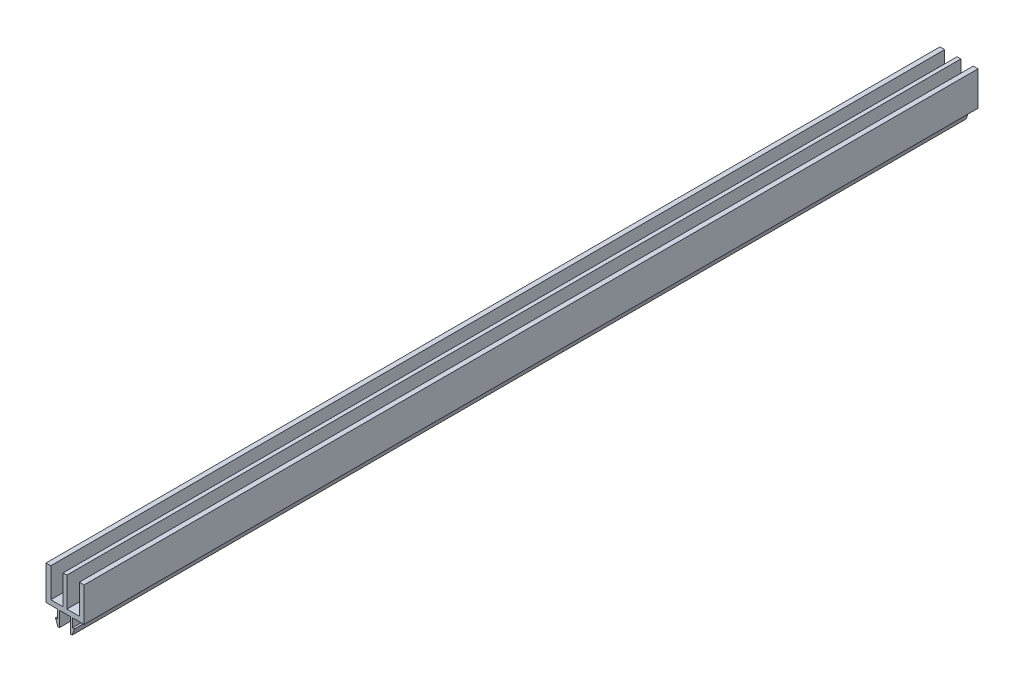
ISO-10303-21;
HEADER;
FILE_DESCRIPTION(('STEP AP214'),'2;1');
FILE_NAME('part.step','',(''),(''),'','','');
FILE_SCHEMA(('AUTOMOTIVE_DESIGN { 1 0 10303 214 1 1 1 1 }'));
ENDSEC;
DATA;
#1=APPLICATION_CONTEXT('core data for automotive mechanical design processes');
#2=APPLICATION_PROTOCOL_DEFINITION('international standard','automotive_design',2000,#1);
#3=PRODUCT_CONTEXT('',#1,'mechanical');
#4=PRODUCT('Part','Part','',(#3));
#5=PRODUCT_RELATED_PRODUCT_CATEGORY('part','',(#4));
#6=PRODUCT_DEFINITION_FORMATION('','',#4);
#7=PRODUCT_DEFINITION_CONTEXT('part definition',#1,'design');
#8=PRODUCT_DEFINITION('design','',#6,#7);
#9=PRODUCT_DEFINITION_SHAPE('','',#8);
#10=(LENGTH_UNIT() NAMED_UNIT(*) SI_UNIT(.MILLI.,.METRE.));
#11=(NAMED_UNIT(*) PLANE_ANGLE_UNIT() SI_UNIT($,.RADIAN.));
#12=(NAMED_UNIT(*) SI_UNIT($,.STERADIAN.) SOLID_ANGLE_UNIT());
#13=UNCERTAINTY_MEASURE_WITH_UNIT(LENGTH_MEASURE(1.E-05),#10,'distance_accuracy_value','');
#14=(GEOMETRIC_REPRESENTATION_CONTEXT(3) GLOBAL_UNCERTAINTY_ASSIGNED_CONTEXT((#13)) GLOBAL_UNIT_ASSIGNED_CONTEXT((#10,
#11,#12)) REPRESENTATION_CONTEXT('',''));
#15=CARTESIAN_POINT('',(0.,0.,0.));
#16=DIRECTION('',(0.,0.,1.));
#17=DIRECTION('',(1.,0.,0.));
#18=AXIS2_PLACEMENT_3D('',#15,#16,#17);
#19=CARTESIAN_POINT('',(-1.,17.9999999975,-420.));
#20=DIRECTION('',(-1.,0.,0.));
#21=DIRECTION('',(0.,-1.,0.));
#22=AXIS2_PLACEMENT_3D('',#19,#20,#21);
#23=PLANE('',#22);
#24=DIRECTION('',(0.,-1.,0.));
#25=VECTOR('',#24,1.);
#26=CARTESIAN_POINT('',(-1.,17.9999999975,50.));
#27=LINE('',#26,#25);
#28=CARTESIAN_POINT('',(-1.,17.9999999975,50.));
#29=VERTEX_POINT('',#28);
#30=CARTESIAN_POINT('',(-1.,2.4999999995,50.));
#31=VERTEX_POINT('',#30);
#32=EDGE_CURVE('E226',#29,#31,#27,.T.);
#33=ORIENTED_EDGE('',*,*,#32,.F.);
#34=DIRECTION('',(0.,0.,1.));
#35=VECTOR('',#34,1.);
#36=CARTESIAN_POINT('',(-1.,17.9999999975,-420.));
#37=LINE('',#36,#35);
#38=CARTESIAN_POINT('',(-1.,17.9999999975,-420.));
#39=VERTEX_POINT('',#38);
#40=EDGE_CURVE('E11',#39,#29,#37,.T.);
#41=ORIENTED_EDGE('',*,*,#40,.F.);
#42=DIRECTION('',(0.,-1.,0.));
#43=VECTOR('',#42,1.);
#44=CARTESIAN_POINT('',(-1.,17.9999999975,-420.));
#45=LINE('',#44,#43);
#46=CARTESIAN_POINT('',(-1.,2.4999999995,-420.));
#47=VERTEX_POINT('',#46);
#48=EDGE_CURVE('E294',#39,#47,#45,.T.);
#49=ORIENTED_EDGE('',*,*,#48,.T.);
#50=DIRECTION('',(0.,0.,1.));
#51=VECTOR('',#50,1.);
#52=CARTESIAN_POINT('',(-1.,2.4999999995,-420.));
#53=LINE('',#52,#51);
#54=EDGE_CURVE('E36',#47,#31,#53,.T.);
#55=ORIENTED_EDGE('',*,*,#54,.T.);
#56=EDGE_LOOP('',(#33,#41,#49,#55));
#57=FACE_BOUND('',#56,.T.);
#58=ADVANCED_FACE('F33',(#57),#23,.T.);
#59=CARTESIAN_POINT('',(0.999999999999998,17.9999999975,-420.));
#60=DIRECTION('',(0.,1.,0.));
#61=DIRECTION('',(0.,0.,1.));
#62=AXIS2_PLACEMENT_3D('',#59,#60,#61);
#63=PLANE('',#62);
#64=DIRECTION('',(-1.,0.,0.));
#65=VECTOR('',#64,1.);
#66=CARTESIAN_POINT('',(0.999999999999998,17.9999999975,50.));
#67=LINE('',#66,#65);
#68=CARTESIAN_POINT('',(0.999999999999998,17.9999999975,50.));
#69=VERTEX_POINT('',#68);
#70=EDGE_CURVE('E292',#69,#29,#67,.T.);
#71=ORIENTED_EDGE('',*,*,#70,.F.);
#72=DIRECTION('',(0.,0.,1.));
#73=VECTOR('',#72,1.);
#74=CARTESIAN_POINT('',(0.999999999999998,17.9999999975,-420.));
#75=LINE('',#74,#73);
#76=CARTESIAN_POINT('',(0.999999999999998,17.9999999975,-420.));
#77=VERTEX_POINT('',#76);
#78=EDGE_CURVE('E42',#77,#69,#75,.T.);
#79=ORIENTED_EDGE('',*,*,#78,.F.);
#80=DIRECTION('',(-1.,0.,0.));
#81=VECTOR('',#80,1.);
#82=CARTESIAN_POINT('',(0.999999999999998,17.9999999975,-420.));
#83=LINE('',#82,#81);
#84=EDGE_CURVE('E216',#77,#39,#83,.T.);
#85=ORIENTED_EDGE('',*,*,#84,.T.);
#86=ORIENTED_EDGE('',*,*,#40,.T.);
#87=EDGE_LOOP('',(#71,#79,#85,#86));
#88=FACE_BOUND('',#87,.T.);
#89=ADVANCED_FACE('F338',(#88),#63,.T.);
#90=CARTESIAN_POINT('',(0.999999999999998,2.4999999995,-420.));
#91=DIRECTION('',(1.,0.,0.));
#92=DIRECTION('',(0.,0.,-1.));
#93=AXIS2_PLACEMENT_3D('',#90,#91,#92);
#94=PLANE('',#93);
#95=DIRECTION('',(0.,1.,0.));
#96=VECTOR('',#95,1.);
#97=CARTESIAN_POINT('',(0.999999999999998,2.4999999995,50.));
#98=LINE('',#97,#96);
#99=CARTESIAN_POINT('',(0.999999999999998,2.4999999995,50.));
#100=VERTEX_POINT('',#99);
#101=EDGE_CURVE('E203',#100,#69,#98,.T.);
#102=ORIENTED_EDGE('',*,*,#101,.F.);
#103=DIRECTION('',(0.,0.,1.));
#104=VECTOR('',#103,1.);
#105=CARTESIAN_POINT('',(0.999999999999998,2.4999999995,-420.));
#106=LINE('',#105,#104);
#107=CARTESIAN_POINT('',(0.999999999999998,2.4999999995,-420.));
#108=VERTEX_POINT('',#107);
#109=EDGE_CURVE('E198',#108,#100,#106,.T.);
#110=ORIENTED_EDGE('',*,*,#109,.F.);
#111=DIRECTION('',(0.,1.,0.));
#112=VECTOR('',#111,1.);
#113=CARTESIAN_POINT('',(0.999999999999998,2.4999999995,-420.));
#114=LINE('',#113,#112);
#115=EDGE_CURVE('E201',#108,#77,#114,.T.);
#116=ORIENTED_EDGE('',*,*,#115,.T.);
#117=ORIENTED_EDGE('',*,*,#78,.T.);
#118=EDGE_LOOP('',(#102,#110,#116,#117));
#119=FACE_BOUND('',#118,.T.);
#120=ADVANCED_FACE('F200',(#119),#94,.T.);
#121=CARTESIAN_POINT('',(7.5,2.4999999995,-420.));
#122=DIRECTION('',(0.,1.,0.));
#123=DIRECTION('',(-1.,0.,0.));
#124=AXIS2_PLACEMENT_3D('',#121,#122,#123);
#125=PLANE('',#124);
#126=DIRECTION('',(-1.,0.,0.));
#127=VECTOR('',#126,1.);
#128=CARTESIAN_POINT('',(7.5,2.4999999995,50.));
#129=LINE('',#128,#127);
#130=CARTESIAN_POINT('',(7.5,2.4999999995,50.));
#131=VERTEX_POINT('',#130);
#132=EDGE_CURVE('E289',#131,#100,#129,.T.);
#133=ORIENTED_EDGE('',*,*,#132,.F.);
#134=DIRECTION('',(0.,0.,1.));
#135=VECTOR('',#134,1.);
#136=CARTESIAN_POINT('',(7.5,2.4999999995,-420.));
#137=LINE('',#136,#135);
#138=CARTESIAN_POINT('',(7.5,2.4999999995,-420.));
#139=VERTEX_POINT('',#138);
#140=EDGE_CURVE('E208',#139,#131,#137,.T.);
#141=ORIENTED_EDGE('',*,*,#140,.F.);
#142=DIRECTION('',(-1.,0.,0.));
#143=VECTOR('',#142,1.);
#144=CARTESIAN_POINT('',(7.5,2.4999999995,-420.));
#145=LINE('',#144,#143);
#146=EDGE_CURVE('E214',#139,#108,#145,.T.);
#147=ORIENTED_EDGE('',*,*,#146,.T.);
#148=ORIENTED_EDGE('',*,*,#109,.T.);
#149=EDGE_LOOP('',(#133,#141,#147,#148));
#150=FACE_BOUND('',#149,.T.);
#151=ADVANCED_FACE('F218',(#150),#125,.T.);
#152=CARTESIAN_POINT('',(7.5,17.9999999975,-420.));
#153=DIRECTION('',(-1.,0.,0.));
#154=DIRECTION('',(0.,-1.,0.));
#155=AXIS2_PLACEMENT_3D('',#152,#153,#154);
#156=PLANE('',#155);
#157=DIRECTION('',(0.,-1.,0.));
#158=VECTOR('',#157,1.);
#159=CARTESIAN_POINT('',(7.5,17.9999999975,50.));
#160=LINE('',#159,#158);
#161=CARTESIAN_POINT('',(7.5,17.9999999975,50.));
#162=VERTEX_POINT('',#161);
#163=EDGE_CURVE('E286',#162,#131,#160,.T.);
#164=ORIENTED_EDGE('',*,*,#163,.F.);
#165=DIRECTION('',(0.,0.,1.));
#166=VECTOR('',#165,1.);
#167=CARTESIAN_POINT('',(7.5,17.9999999975,-420.));
#168=LINE('',#167,#166);
#169=CARTESIAN_POINT('',(7.5,17.9999999975,-420.));
#170=VERTEX_POINT('',#169);
#171=EDGE_CURVE('E298',#170,#162,#168,.T.);
#172=ORIENTED_EDGE('',*,*,#171,.F.);
#173=DIRECTION('',(0.,-1.,0.));
#174=VECTOR('',#173,1.);
#175=CARTESIAN_POINT('',(7.5,17.9999999975,-420.));
#176=LINE('',#175,#174);
#177=EDGE_CURVE('E219',#170,#139,#176,.T.);
#178=ORIENTED_EDGE('',*,*,#177,.T.);
#179=ORIENTED_EDGE('',*,*,#140,.T.);
#180=EDGE_LOOP('',(#164,#172,#178,#179));
#181=FACE_BOUND('',#180,.T.);
#182=ADVANCED_FACE('F351',(#181),#156,.T.);
#183=CARTESIAN_POINT('',(10.,17.9999999975,-420.));
#184=DIRECTION('',(0.,1.,0.));
#185=DIRECTION('',(0.,0.,1.));
#186=AXIS2_PLACEMENT_3D('',#183,#184,#185);
#187=PLANE('',#186);
#188=DIRECTION('',(-1.,0.,0.));
#189=VECTOR('',#188,1.);
#190=CARTESIAN_POINT('',(10.,17.9999999975,50.));
#191=LINE('',#190,#189);
#192=CARTESIAN_POINT('',(10.,17.9999999975,50.));
#193=VERTEX_POINT('',#192);
#194=EDGE_CURVE('E283',#193,#162,#191,.T.);
#195=ORIENTED_EDGE('',*,*,#194,.F.);
#196=DIRECTION('',(0.,0.,1.));
#197=VECTOR('',#196,1.);
#198=CARTESIAN_POINT('',(10.,17.9999999975,-420.));
#199=LINE('',#198,#197);
#200=CARTESIAN_POINT('',(10.,17.9999999975,-420.));
#201=VERTEX_POINT('',#200);
#202=EDGE_CURVE('E300',#201,#193,#199,.T.);
#203=ORIENTED_EDGE('',*,*,#202,.F.);
#204=DIRECTION('',(-1.,0.,0.));
#205=VECTOR('',#204,1.);
#206=CARTESIAN_POINT('',(10.,17.9999999975,-420.));
#207=LINE('',#206,#205);
#208=EDGE_CURVE('E221',#201,#170,#207,.T.);
#209=ORIENTED_EDGE('',*,*,#208,.T.);
#210=ORIENTED_EDGE('',*,*,#171,.T.);
#211=EDGE_LOOP('',(#195,#203,#209,#210));
#212=FACE_BOUND('',#211,.T.);
#213=ADVANCED_FACE('F354',(#212),#187,.T.);
#214=CARTESIAN_POINT('',(10.,-4.99999828349541E-10,-420.));
#215=DIRECTION('',(1.,0.,0.));
#216=DIRECTION('',(0.,0.,-1.));
#217=AXIS2_PLACEMENT_3D('',#214,#215,#216);
#218=PLANE('',#217);
#219=DIRECTION('',(0.,1.,0.));
#220=VECTOR('',#219,1.);
#221=CARTESIAN_POINT('',(10.,-4.99999828349541E-10,50.));
#222=LINE('',#221,#220);
#223=CARTESIAN_POINT('',(10.,-4.99999828349541E-10,50.));
#224=VERTEX_POINT('',#223);
#225=EDGE_CURVE('E280',#224,#193,#222,.T.);
#226=ORIENTED_EDGE('',*,*,#225,.F.);
#227=DIRECTION('',(0.,0.,1.));
#228=VECTOR('',#227,1.);
#229=CARTESIAN_POINT('',(10.,-4.99999828349541E-10,-420.));
#230=LINE('',#229,#228);
#231=CARTESIAN_POINT('',(10.,-4.99999828349541E-10,-420.));
#232=VERTEX_POINT('',#231);
#233=EDGE_CURVE('E302',#232,#224,#230,.T.);
#234=ORIENTED_EDGE('',*,*,#233,.F.);
#235=DIRECTION('',(0.,1.,0.));
#236=VECTOR('',#235,1.);
#237=CARTESIAN_POINT('',(10.,-4.99999828349541E-10,-420.));
#238=LINE('',#237,#236);
#239=EDGE_CURVE('E644',#232,#201,#238,.T.);
#240=ORIENTED_EDGE('',*,*,#239,.T.);
#241=ORIENTED_EDGE('',*,*,#202,.T.);
#242=EDGE_LOOP('',(#226,#234,#240,#241));
#243=FACE_BOUND('',#242,.T.);
#244=ADVANCED_FACE('F358',(#243),#218,.T.);
#245=CARTESIAN_POINT('',(4.,-4.99999998002099E-10,-420.));
#246=DIRECTION('',(0.,-1.,0.));
#247=DIRECTION('',(1.,0.,0.));
#248=AXIS2_PLACEMENT_3D('',#245,#246,#247);
#249=PLANE('',#248);
#250=DIRECTION('',(1.,0.,0.));
#251=VECTOR('',#250,1.);
#252=CARTESIAN_POINT('',(4.,-4.99999998002099E-10,50.));
#253=LINE('',#252,#251);
#254=CARTESIAN_POINT('',(4.,-4.99999998002099E-10,50.));
#255=VERTEX_POINT('',#254);
#256=EDGE_CURVE('E277',#255,#224,#253,.T.);
#257=ORIENTED_EDGE('',*,*,#256,.F.);
#258=DIRECTION('',(0.,0.,1.));
#259=VECTOR('',#258,1.);
#260=CARTESIAN_POINT('',(4.,-4.99999998002099E-10,-420.));
#261=LINE('',#260,#259);
#262=CARTESIAN_POINT('',(4.,-4.99999998002099E-10,-420.));
#263=VERTEX_POINT('',#262);
#264=EDGE_CURVE('E304',#263,#255,#261,.T.);
#265=ORIENTED_EDGE('',*,*,#264,.F.);
#266=DIRECTION('',(1.,0.,0.));
#267=VECTOR('',#266,1.);
#268=CARTESIAN_POINT('',(4.,-4.99999998002099E-10,-420.));
#269=LINE('',#268,#267);
#270=EDGE_CURVE('E648',#263,#232,#269,.T.);
#271=ORIENTED_EDGE('',*,*,#270,.T.);
#272=ORIENTED_EDGE('',*,*,#233,.T.);
#273=EDGE_LOOP('',(#257,#265,#271,#272));
#274=FACE_BOUND('',#273,.T.);
#275=ADVANCED_FACE('F362',(#274),#249,.T.);
#276=CARTESIAN_POINT('',(4.,-4.5,-420.));
#277=DIRECTION('',(1.,0.,0.));
#278=DIRECTION('',(0.,0.,-1.));
#279=AXIS2_PLACEMENT_3D('',#276,#277,#278);
#280=PLANE('',#279);
#281=DIRECTION('',(0.,1.,0.));
#282=VECTOR('',#281,1.);
#283=CARTESIAN_POINT('',(4.,-4.5,50.));
#284=LINE('',#283,#282);
#285=CARTESIAN_POINT('',(4.,-4.5,50.));
#286=VERTEX_POINT('',#285);
#287=EDGE_CURVE('E274',#286,#255,#284,.T.);
#288=ORIENTED_EDGE('',*,*,#287,.F.);
#289=DIRECTION('',(0.,0.,1.));
#290=VECTOR('',#289,1.);
#291=CARTESIAN_POINT('',(4.,-4.5,-420.));
#292=LINE('',#291,#290);
#293=CARTESIAN_POINT('',(4.,-4.5,-420.));
#294=VERTEX_POINT('',#293);
#295=EDGE_CURVE('E306',#294,#286,#292,.T.);
#296=ORIENTED_EDGE('',*,*,#295,.F.);
#297=DIRECTION('',(0.,1.,0.));
#298=VECTOR('',#297,1.);
#299=CARTESIAN_POINT('',(4.,-4.5,-420.));
#300=LINE('',#299,#298);
#301=EDGE_CURVE('E637',#294,#263,#300,.T.);
#302=ORIENTED_EDGE('',*,*,#301,.T.);
#303=ORIENTED_EDGE('',*,*,#264,.T.);
#304=EDGE_LOOP('',(#288,#296,#302,#303));
#305=FACE_BOUND('',#304,.T.);
#306=ADVANCED_FACE('F366',(#305),#280,.T.);
#307=CARTESIAN_POINT('',(5.,-4.5,-420.));
#308=DIRECTION('',(0.,1.,0.));
#309=DIRECTION('',(0.,0.,1.));
#310=AXIS2_PLACEMENT_3D('',#307,#308,#309);
#311=PLANE('',#310);
#312=DIRECTION('',(-1.,0.,0.));
#313=VECTOR('',#312,1.);
#314=CARTESIAN_POINT('',(5.,-4.5,50.));
#315=LINE('',#314,#313);
#316=CARTESIAN_POINT('',(5.,-4.5,50.));
#317=VERTEX_POINT('',#316);
#318=EDGE_CURVE('E271',#317,#286,#315,.T.);
#319=ORIENTED_EDGE('',*,*,#318,.F.);
#320=DIRECTION('',(0.,0.,1.));
#321=VECTOR('',#320,1.);
#322=CARTESIAN_POINT('',(5.,-4.5,-420.));
#323=LINE('',#322,#321);
#324=CARTESIAN_POINT('',(5.,-4.5,-420.));
#325=VERTEX_POINT('',#324);
#326=EDGE_CURVE('E308',#325,#317,#323,.T.);
#327=ORIENTED_EDGE('',*,*,#326,.F.);
#328=DIRECTION('',(-1.,0.,0.));
#329=VECTOR('',#328,1.);
#330=CARTESIAN_POINT('',(5.,-4.5,-420.));
#331=LINE('',#330,#329);
#332=EDGE_CURVE('E633',#325,#294,#331,.T.);
#333=ORIENTED_EDGE('',*,*,#332,.T.);
#334=ORIENTED_EDGE('',*,*,#295,.T.);
#335=EDGE_LOOP('',(#319,#327,#333,#334));
#336=FACE_BOUND('',#335,.T.);
#337=ADVANCED_FACE('F370',(#336),#311,.T.);
#338=CARTESIAN_POINT('',(3.75,-8.,-420.));
#339=DIRECTION('',(0.941741911594837,-0.336336396998157,0.));
#340=DIRECTION('',(0.336336396998157,0.941741911594837,0.));
#341=AXIS2_PLACEMENT_3D('',#338,#339,#340);
#342=PLANE('',#341);
#343=DIRECTION('',(0.336336396998157,0.941741911594837,0.));
#344=VECTOR('',#343,1.);
#345=CARTESIAN_POINT('',(3.75,-8.,50.));
#346=LINE('',#345,#344);
#347=CARTESIAN_POINT('',(3.75,-8.,50.));
#348=VERTEX_POINT('',#347);
#349=EDGE_CURVE('E268',#348,#317,#346,.T.);
#350=ORIENTED_EDGE('',*,*,#349,.F.);
#351=DIRECTION('',(0.,0.,1.));
#352=VECTOR('',#351,1.);
#353=CARTESIAN_POINT('',(3.75,-8.,-420.));
#354=LINE('',#353,#352);
#355=CARTESIAN_POINT('',(3.75,-8.,-420.));
#356=VERTEX_POINT('',#355);
#357=EDGE_CURVE('E310',#356,#348,#354,.T.);
#358=ORIENTED_EDGE('',*,*,#357,.F.);
#359=DIRECTION('',(0.336336396998157,0.941741911594837,0.));
#360=VECTOR('',#359,1.);
#361=CARTESIAN_POINT('',(3.75,-8.,-420.));
#362=LINE('',#361,#360);
#363=EDGE_CURVE('E654',#356,#325,#362,.T.);
#364=ORIENTED_EDGE('',*,*,#363,.T.);
#365=ORIENTED_EDGE('',*,*,#326,.T.);
#366=EDGE_LOOP('',(#350,#358,#364,#365));
#367=FACE_BOUND('',#366,.T.);
#368=ADVANCED_FACE('F374',(#367),#342,.T.);
#369=CARTESIAN_POINT('',(3.,-8.,-420.));
#370=DIRECTION('',(0.,-1.,0.));
#371=DIRECTION('',(0.,0.,-1.));
#372=AXIS2_PLACEMENT_3D('',#369,#370,#371);
#373=PLANE('',#372);
#374=DIRECTION('',(1.,0.,0.));
#375=VECTOR('',#374,1.);
#376=CARTESIAN_POINT('',(3.,-8.,50.));
#377=LINE('',#376,#375);
#378=CARTESIAN_POINT('',(3.,-8.,50.));
#379=VERTEX_POINT('',#378);
#380=EDGE_CURVE('E265',#379,#348,#377,.T.);
#381=ORIENTED_EDGE('',*,*,#380,.F.);
#382=DIRECTION('',(0.,0.,1.));
#383=VECTOR('',#382,1.);
#384=CARTESIAN_POINT('',(3.,-8.,-420.));
#385=LINE('',#384,#383);
#386=CARTESIAN_POINT('',(3.,-8.,-420.));
#387=VERTEX_POINT('',#386);
#388=EDGE_CURVE('E312',#387,#379,#385,.T.);
#389=ORIENTED_EDGE('',*,*,#388,.F.);
#390=DIRECTION('',(1.,0.,0.));
#391=VECTOR('',#390,1.);
#392=CARTESIAN_POINT('',(3.,-8.,-420.));
#393=LINE('',#392,#391);
#394=EDGE_CURVE('E626',#387,#356,#393,.T.);
#395=ORIENTED_EDGE('',*,*,#394,.T.);
#396=ORIENTED_EDGE('',*,*,#357,.T.);
#397=EDGE_LOOP('',(#381,#389,#395,#396));
#398=FACE_BOUND('',#397,.T.);
#399=ADVANCED_FACE('F378',(#398),#373,.T.);
#400=CARTESIAN_POINT('',(3.,-4.9999985194348E-10,-420.));
#401=DIRECTION('',(-1.,0.,0.));
#402=DIRECTION('',(0.,0.,1.));
#403=AXIS2_PLACEMENT_3D('',#400,#401,#402);
#404=PLANE('',#403);
#405=DIRECTION('',(0.,-1.,0.));
#406=VECTOR('',#405,1.);
#407=CARTESIAN_POINT('',(3.,-4.9999985194348E-10,50.));
#408=LINE('',#407,#406);
#409=CARTESIAN_POINT('',(3.,-4.9999985194348E-10,50.));
#410=VERTEX_POINT('',#409);
#411=EDGE_CURVE('E262',#410,#379,#408,.T.);
#412=ORIENTED_EDGE('',*,*,#411,.F.);
#413=DIRECTION('',(0.,0.,1.));
#414=VECTOR('',#413,1.);
#415=CARTESIAN_POINT('',(3.,-4.9999985194348E-10,-420.));
#416=LINE('',#415,#414);
#417=CARTESIAN_POINT('',(3.,-4.9999985194348E-10,-420.));
#418=VERTEX_POINT('',#417);
#419=EDGE_CURVE('E314',#418,#410,#416,.T.);
#420=ORIENTED_EDGE('',*,*,#419,.F.);
#421=DIRECTION('',(0.,-1.,0.));
#422=VECTOR('',#421,1.);
#423=CARTESIAN_POINT('',(3.,-4.9999985194348E-10,-420.));
#424=LINE('',#423,#422);
#425=EDGE_CURVE('E622',#418,#387,#424,.T.);
#426=ORIENTED_EDGE('',*,*,#425,.T.);
#427=ORIENTED_EDGE('',*,*,#388,.T.);
#428=EDGE_LOOP('',(#412,#420,#426,#427));
#429=FACE_BOUND('',#428,.T.);
#430=ADVANCED_FACE('F382',(#429),#404,.T.);
#431=CARTESIAN_POINT('',(-3.,-4.99999455901012E-10,-420.));
#432=DIRECTION('',(0.,-1.,0.));
#433=DIRECTION('',(1.,0.,0.));
#434=AXIS2_PLACEMENT_3D('',#431,#432,#433);
#435=PLANE('',#434);
#436=DIRECTION('',(1.,0.,0.));
#437=VECTOR('',#436,1.);
#438=CARTESIAN_POINT('',(-3.,-4.99999455901012E-10,50.));
#439=LINE('',#438,#437);
#440=CARTESIAN_POINT('',(-3.,-4.99999455901012E-10,50.));
#441=VERTEX_POINT('',#440);
#442=EDGE_CURVE('E259',#441,#410,#439,.T.);
#443=ORIENTED_EDGE('',*,*,#442,.F.);
#444=DIRECTION('',(0.,0.,1.));
#445=VECTOR('',#444,1.);
#446=CARTESIAN_POINT('',(-3.,-4.99999455901012E-10,-420.));
#447=LINE('',#446,#445);
#448=CARTESIAN_POINT('',(-3.,-4.99999455901012E-10,-420.));
#449=VERTEX_POINT('',#448);
#450=EDGE_CURVE('E316',#449,#441,#447,.T.);
#451=ORIENTED_EDGE('',*,*,#450,.F.);
#452=DIRECTION('',(1.,0.,0.));
#453=VECTOR('',#452,1.);
#454=CARTESIAN_POINT('',(-3.,-4.99999455901012E-10,-420.));
#455=LINE('',#454,#453);
#456=EDGE_CURVE('E658',#449,#418,#455,.T.);
#457=ORIENTED_EDGE('',*,*,#456,.T.);
#458=ORIENTED_EDGE('',*,*,#419,.T.);
#459=EDGE_LOOP('',(#443,#451,#457,#458));
#460=FACE_BOUND('',#459,.T.);
#461=ADVANCED_FACE('F386',(#460),#435,.T.);
#462=CARTESIAN_POINT('',(-3.,-8.,-420.));
#463=DIRECTION('',(1.,0.,0.));
#464=DIRECTION('',(0.,0.,-1.));
#465=AXIS2_PLACEMENT_3D('',#462,#463,#464);
#466=PLANE('',#465);
#467=DIRECTION('',(0.,1.,0.));
#468=VECTOR('',#467,1.);
#469=CARTESIAN_POINT('',(-3.,-8.,50.));
#470=LINE('',#469,#468);
#471=CARTESIAN_POINT('',(-3.,-8.,50.));
#472=VERTEX_POINT('',#471);
#473=EDGE_CURVE('E256',#472,#441,#470,.T.);
#474=ORIENTED_EDGE('',*,*,#473,.F.);
#475=DIRECTION('',(0.,0.,1.));
#476=VECTOR('',#475,1.);
#477=CARTESIAN_POINT('',(-3.,-8.,-420.));
#478=LINE('',#477,#476);
#479=CARTESIAN_POINT('',(-3.,-8.,-420.));
#480=VERTEX_POINT('',#479);
#481=EDGE_CURVE('E318',#480,#472,#478,.T.);
#482=ORIENTED_EDGE('',*,*,#481,.F.);
#483=DIRECTION('',(0.,1.,0.));
#484=VECTOR('',#483,1.);
#485=CARTESIAN_POINT('',(-3.,-8.,-420.));
#486=LINE('',#485,#484);
#487=EDGE_CURVE('E615',#480,#449,#486,.T.);
#488=ORIENTED_EDGE('',*,*,#487,.T.);
#489=ORIENTED_EDGE('',*,*,#450,.T.);
#490=EDGE_LOOP('',(#474,#482,#488,#489));
#491=FACE_BOUND('',#490,.T.);
#492=ADVANCED_FACE('F390',(#491),#466,.T.);
#493=CARTESIAN_POINT('',(-3.75,-8.,-420.));
#494=DIRECTION('',(0.,-1.,0.));
#495=DIRECTION('',(0.,0.,-1.));
#496=AXIS2_PLACEMENT_3D('',#493,#494,#495);
#497=PLANE('',#496);
#498=DIRECTION('',(1.,0.,0.));
#499=VECTOR('',#498,1.);
#500=CARTESIAN_POINT('',(-3.75,-8.,50.));
#501=LINE('',#500,#499);
#502=CARTESIAN_POINT('',(-3.75,-8.,50.));
#503=VERTEX_POINT('',#502);
#504=EDGE_CURVE('E253',#503,#472,#501,.T.);
#505=ORIENTED_EDGE('',*,*,#504,.F.);
#506=DIRECTION('',(0.,0.,1.));
#507=VECTOR('',#506,1.);
#508=CARTESIAN_POINT('',(-3.75,-8.,-420.));
#509=LINE('',#508,#507);
#510=CARTESIAN_POINT('',(-3.75,-8.,-420.));
#511=VERTEX_POINT('',#510);
#512=EDGE_CURVE('E320',#511,#503,#509,.T.);
#513=ORIENTED_EDGE('',*,*,#512,.F.);
#514=DIRECTION('',(1.,0.,0.));
#515=VECTOR('',#514,1.);
#516=CARTESIAN_POINT('',(-3.75,-8.,-420.));
#517=LINE('',#516,#515);
#518=EDGE_CURVE('E611',#511,#480,#517,.T.);
#519=ORIENTED_EDGE('',*,*,#518,.T.);
#520=ORIENTED_EDGE('',*,*,#481,.T.);
#521=EDGE_LOOP('',(#505,#513,#519,#520));
#522=FACE_BOUND('',#521,.T.);
#523=ADVANCED_FACE('F394',(#522),#497,.T.);
#524=CARTESIAN_POINT('',(-5.,-4.5,-420.));
#525=DIRECTION('',(-0.941741911594837,-0.336336396998156,0.));
#526=DIRECTION('',(0.336336396998156,-0.941741911594837,0.));
#527=AXIS2_PLACEMENT_3D('',#524,#525,#526);
#528=PLANE('',#527);
#529=DIRECTION('',(0.336336396998156,-0.941741911594837,0.));
#530=VECTOR('',#529,1.);
#531=CARTESIAN_POINT('',(-5.,-4.5,50.));
#532=LINE('',#531,#530);
#533=CARTESIAN_POINT('',(-5.,-4.5,50.));
#534=VERTEX_POINT('',#533);
#535=EDGE_CURVE('E250',#534,#503,#532,.T.);
#536=ORIENTED_EDGE('',*,*,#535,.F.);
#537=DIRECTION('',(0.,0.,1.));
#538=VECTOR('',#537,1.);
#539=CARTESIAN_POINT('',(-5.,-4.5,-420.));
#540=LINE('',#539,#538);
#541=CARTESIAN_POINT('',(-5.,-4.5,-420.));
#542=VERTEX_POINT('',#541);
#543=EDGE_CURVE('E322',#542,#534,#540,.T.);
#544=ORIENTED_EDGE('',*,*,#543,.F.);
#545=DIRECTION('',(0.336336396998156,-0.941741911594837,0.));
#546=VECTOR('',#545,1.);
#547=CARTESIAN_POINT('',(-5.,-4.5,-420.));
#548=LINE('',#547,#546);
#549=EDGE_CURVE('E662',#542,#511,#548,.T.);
#550=ORIENTED_EDGE('',*,*,#549,.T.);
#551=ORIENTED_EDGE('',*,*,#512,.T.);
#552=EDGE_LOOP('',(#536,#544,#550,#551));
#553=FACE_BOUND('',#552,.T.);
#554=ADVANCED_FACE('F398',(#553),#528,.T.);
#555=CARTESIAN_POINT('',(-4.,-4.5,-420.));
#556=DIRECTION('',(0.,1.,0.));
#557=DIRECTION('',(0.,0.,1.));
#558=AXIS2_PLACEMENT_3D('',#555,#556,#557);
#559=PLANE('',#558);
#560=DIRECTION('',(-1.,0.,0.));
#561=VECTOR('',#560,1.);
#562=CARTESIAN_POINT('',(-4.,-4.5,50.));
#563=LINE('',#562,#561);
#564=CARTESIAN_POINT('',(-4.,-4.5,50.));
#565=VERTEX_POINT('',#564);
#566=EDGE_CURVE('E247',#565,#534,#563,.T.);
#567=ORIENTED_EDGE('',*,*,#566,.F.);
#568=DIRECTION('',(0.,0.,1.));
#569=VECTOR('',#568,1.);
#570=CARTESIAN_POINT('',(-4.,-4.5,-420.));
#571=LINE('',#570,#569);
#572=CARTESIAN_POINT('',(-4.,-4.5,-420.));
#573=VERTEX_POINT('',#572);
#574=EDGE_CURVE('E324',#573,#565,#571,.T.);
#575=ORIENTED_EDGE('',*,*,#574,.F.);
#576=DIRECTION('',(-1.,0.,0.));
#577=VECTOR('',#576,1.);
#578=CARTESIAN_POINT('',(-4.,-4.5,-420.));
#579=LINE('',#578,#577);
#580=EDGE_CURVE('E604',#573,#542,#579,.T.);
#581=ORIENTED_EDGE('',*,*,#580,.T.);
#582=ORIENTED_EDGE('',*,*,#543,.T.);
#583=EDGE_LOOP('',(#567,#575,#581,#582));
#584=FACE_BOUND('',#583,.T.);
#585=ADVANCED_FACE('F402',(#584),#559,.T.);
#586=CARTESIAN_POINT('',(-4.,-4.9999985194348E-10,-420.));
#587=DIRECTION('',(-1.,0.,0.));
#588=DIRECTION('',(0.,0.,1.));
#589=AXIS2_PLACEMENT_3D('',#586,#587,#588);
#590=PLANE('',#589);
#591=DIRECTION('',(0.,-1.,0.));
#592=VECTOR('',#591,1.);
#593=CARTESIAN_POINT('',(-4.,-4.9999985194348E-10,50.));
#594=LINE('',#593,#592);
#595=CARTESIAN_POINT('',(-4.,-4.9999985194348E-10,50.));
#596=VERTEX_POINT('',#595);
#597=EDGE_CURVE('E244',#596,#565,#594,.T.);
#598=ORIENTED_EDGE('',*,*,#597,.F.);
#599=DIRECTION('',(0.,0.,1.));
#600=VECTOR('',#599,1.);
#601=CARTESIAN_POINT('',(-4.,-4.9999985194348E-10,-420.));
#602=LINE('',#601,#600);
#603=CARTESIAN_POINT('',(-4.,-4.9999985194348E-10,-420.));
#604=VERTEX_POINT('',#603);
#605=EDGE_CURVE('E326',#604,#596,#602,.T.);
#606=ORIENTED_EDGE('',*,*,#605,.F.);
#607=DIRECTION('',(0.,-1.,0.));
#608=VECTOR('',#607,1.);
#609=CARTESIAN_POINT('',(-4.,-4.9999985194348E-10,-420.));
#610=LINE('',#609,#608);
#611=EDGE_CURVE('E600',#604,#573,#610,.T.);
#612=ORIENTED_EDGE('',*,*,#611,.T.);
#613=ORIENTED_EDGE('',*,*,#574,.T.);
#614=EDGE_LOOP('',(#598,#606,#612,#613));
#615=FACE_BOUND('',#614,.T.);
#616=ADVANCED_FACE('F406',(#615),#590,.T.);
#617=CARTESIAN_POINT('',(-10.,-4.99999719929324E-10,-420.));
#618=DIRECTION('',(0.,-1.,0.));
#619=DIRECTION('',(1.,0.,0.));
#620=AXIS2_PLACEMENT_3D('',#617,#618,#619);
#621=PLANE('',#620);
#622=DIRECTION('',(1.,0.,0.));
#623=VECTOR('',#622,1.);
#624=CARTESIAN_POINT('',(-10.,-4.99999719929324E-10,50.));
#625=LINE('',#624,#623);
#626=CARTESIAN_POINT('',(-10.,-4.99999719929324E-10,50.));
#627=VERTEX_POINT('',#626);
#628=EDGE_CURVE('E241',#627,#596,#625,.T.);
#629=ORIENTED_EDGE('',*,*,#628,.F.);
#630=DIRECTION('',(0.,0.,1.));
#631=VECTOR('',#630,1.);
#632=CARTESIAN_POINT('',(-10.,-4.99999719929324E-10,-420.));
#633=LINE('',#632,#631);
#634=CARTESIAN_POINT('',(-10.,-4.99999719929324E-10,-420.));
#635=VERTEX_POINT('',#634);
#636=EDGE_CURVE('E328',#635,#627,#633,.T.);
#637=ORIENTED_EDGE('',*,*,#636,.F.);
#638=DIRECTION('',(1.,0.,0.));
#639=VECTOR('',#638,1.);
#640=CARTESIAN_POINT('',(-10.,-4.99999719929324E-10,-420.));
#641=LINE('',#640,#639);
#642=EDGE_CURVE('E666',#635,#604,#641,.T.);
#643=ORIENTED_EDGE('',*,*,#642,.T.);
#644=ORIENTED_EDGE('',*,*,#605,.T.);
#645=EDGE_LOOP('',(#629,#637,#643,#644));
#646=FACE_BOUND('',#645,.T.);
#647=ADVANCED_FACE('F410',(#646),#621,.T.);
#648=CARTESIAN_POINT('',(-10.,17.9999999975,-420.));
#649=DIRECTION('',(-1.,0.,0.));
#650=DIRECTION('',(0.,-1.,0.));
#651=AXIS2_PLACEMENT_3D('',#648,#649,#650);
#652=PLANE('',#651);
#653=DIRECTION('',(0.,-1.,0.));
#654=VECTOR('',#653,1.);
#655=CARTESIAN_POINT('',(-10.,17.9999999975,50.));
#656=LINE('',#655,#654);
#657=CARTESIAN_POINT('',(-10.,17.9999999975,50.));
#658=VERTEX_POINT('',#657);
#659=EDGE_CURVE('E238',#658,#627,#656,.T.);
#660=ORIENTED_EDGE('',*,*,#659,.F.);
#661=DIRECTION('',(0.,0.,1.));
#662=VECTOR('',#661,1.);
#663=CARTESIAN_POINT('',(-10.,17.9999999975,-420.));
#664=LINE('',#663,#662);
#665=CARTESIAN_POINT('',(-10.,17.9999999975,-420.));
#666=VERTEX_POINT('',#665);
#667=EDGE_CURVE('E330',#666,#658,#664,.T.);
#668=ORIENTED_EDGE('',*,*,#667,.F.);
#669=DIRECTION('',(0.,-1.,0.));
#670=VECTOR('',#669,1.);
#671=CARTESIAN_POINT('',(-10.,17.9999999975,-420.));
#672=LINE('',#671,#670);
#673=EDGE_CURVE('E593',#666,#635,#672,.T.);
#674=ORIENTED_EDGE('',*,*,#673,.T.);
#675=ORIENTED_EDGE('',*,*,#636,.T.);
#676=EDGE_LOOP('',(#660,#668,#674,#675));
#677=FACE_BOUND('',#676,.T.);
#678=ADVANCED_FACE('F414',(#677),#652,.T.);
#679=CARTESIAN_POINT('',(-7.5,17.9999999975,-420.));
#680=DIRECTION('',(0.,1.,0.));
#681=DIRECTION('',(0.,0.,1.));
#682=AXIS2_PLACEMENT_3D('',#679,#680,#681);
#683=PLANE('',#682);
#684=DIRECTION('',(-1.,0.,0.));
#685=VECTOR('',#684,1.);
#686=CARTESIAN_POINT('',(-7.5,17.9999999975,50.));
#687=LINE('',#686,#685);
#688=CARTESIAN_POINT('',(-7.5,17.9999999975,50.));
#689=VERTEX_POINT('',#688);
#690=EDGE_CURVE('E235',#689,#658,#687,.T.);
#691=ORIENTED_EDGE('',*,*,#690,.F.);
#692=DIRECTION('',(0.,0.,1.));
#693=VECTOR('',#692,1.);
#694=CARTESIAN_POINT('',(-7.5,17.9999999975,-420.));
#695=LINE('',#694,#693);
#696=CARTESIAN_POINT('',(-7.5,17.9999999975,-420.));
#697=VERTEX_POINT('',#696);
#698=EDGE_CURVE('E332',#697,#689,#695,.T.);
#699=ORIENTED_EDGE('',*,*,#698,.F.);
#700=DIRECTION('',(-1.,0.,0.));
#701=VECTOR('',#700,1.);
#702=CARTESIAN_POINT('',(-7.5,17.9999999975,-420.));
#703=LINE('',#702,#701);
#704=EDGE_CURVE('E589',#697,#666,#703,.T.);
#705=ORIENTED_EDGE('',*,*,#704,.T.);
#706=ORIENTED_EDGE('',*,*,#667,.T.);
#707=EDGE_LOOP('',(#691,#699,#705,#706));
#708=FACE_BOUND('',#707,.T.);
#709=ADVANCED_FACE('F418',(#708),#683,.T.);
#710=CARTESIAN_POINT('',(-7.5,2.4999999995,-420.));
#711=DIRECTION('',(1.,0.,0.));
#712=DIRECTION('',(0.,0.,-1.));
#713=AXIS2_PLACEMENT_3D('',#710,#711,#712);
#714=PLANE('',#713);
#715=DIRECTION('',(0.,1.,0.));
#716=VECTOR('',#715,1.);
#717=CARTESIAN_POINT('',(-7.5,2.4999999995,50.));
#718=LINE('',#717,#716);
#719=CARTESIAN_POINT('',(-7.5,2.4999999995,50.));
#720=VERTEX_POINT('',#719);
#721=EDGE_CURVE('E232',#720,#689,#718,.T.);
#722=ORIENTED_EDGE('',*,*,#721,.F.);
#723=DIRECTION('',(0.,0.,1.));
#724=VECTOR('',#723,1.);
#725=CARTESIAN_POINT('',(-7.5,2.4999999995,-420.));
#726=LINE('',#725,#724);
#727=CARTESIAN_POINT('',(-7.5,2.4999999995,-420.));
#728=VERTEX_POINT('',#727);
#729=EDGE_CURVE('E333',#728,#720,#726,.T.);
#730=ORIENTED_EDGE('',*,*,#729,.F.);
#731=DIRECTION('',(0.,1.,0.));
#732=VECTOR('',#731,1.);
#733=CARTESIAN_POINT('',(-7.5,2.4999999995,-420.));
#734=LINE('',#733,#732);
#735=EDGE_CURVE('E670',#728,#697,#734,.T.);
#736=ORIENTED_EDGE('',*,*,#735,.T.);
#737=ORIENTED_EDGE('',*,*,#698,.T.);
#738=EDGE_LOOP('',(#722,#730,#736,#737));
#739=FACE_BOUND('',#738,.T.);
#740=ADVANCED_FACE('F422',(#739),#714,.T.);
#741=CARTESIAN_POINT('',(-1.,2.4999999995,-420.));
#742=DIRECTION('',(0.,1.,0.));
#743=DIRECTION('',(-1.,0.,0.));
#744=AXIS2_PLACEMENT_3D('',#741,#742,#743);
#745=PLANE('',#744);
#746=DIRECTION('',(-1.,0.,0.));
#747=VECTOR('',#746,1.);
#748=CARTESIAN_POINT('',(-1.,2.4999999995,50.));
#749=LINE('',#748,#747);
#750=EDGE_CURVE('E229',#31,#720,#749,.T.);
#751=ORIENTED_EDGE('',*,*,#750,.F.);
#752=ORIENTED_EDGE('',*,*,#54,.F.);
#753=DIRECTION('',(-1.,0.,0.));
#754=VECTOR('',#753,1.);
#755=CARTESIAN_POINT('',(-1.,2.4999999995,-420.));
#756=LINE('',#755,#754);
#757=EDGE_CURVE('E672',#47,#728,#756,.T.);
#758=ORIENTED_EDGE('',*,*,#757,.T.);
#759=ORIENTED_EDGE('',*,*,#729,.T.);
#760=EDGE_LOOP('',(#751,#752,#758,#759));
#761=FACE_BOUND('',#760,.T.);
#762=ADVANCED_FACE('F335',(#761),#745,.T.);
#763=CARTESIAN_POINT('',(0.,0.,-420.));
#764=DIRECTION('',(0.,0.,-1.));
#765=DIRECTION('',(-1.,0.,0.));
#766=AXIS2_PLACEMENT_3D('',#763,#764,#765);
#767=PLANE('',#766);
#768=ORIENTED_EDGE('',*,*,#48,.F.);
#769=ORIENTED_EDGE('',*,*,#84,.F.);
#770=ORIENTED_EDGE('',*,*,#115,.F.);
#771=ORIENTED_EDGE('',*,*,#146,.F.);
#772=ORIENTED_EDGE('',*,*,#177,.F.);
#773=ORIENTED_EDGE('',*,*,#208,.F.);
#774=ORIENTED_EDGE('',*,*,#239,.F.);
#775=ORIENTED_EDGE('',*,*,#270,.F.);
#776=ORIENTED_EDGE('',*,*,#301,.F.);
#777=ORIENTED_EDGE('',*,*,#332,.F.);
#778=ORIENTED_EDGE('',*,*,#363,.F.);
#779=ORIENTED_EDGE('',*,*,#394,.F.);
#780=ORIENTED_EDGE('',*,*,#425,.F.);
#781=ORIENTED_EDGE('',*,*,#456,.F.);
#782=ORIENTED_EDGE('',*,*,#487,.F.);
#783=ORIENTED_EDGE('',*,*,#518,.F.);
#784=ORIENTED_EDGE('',*,*,#549,.F.);
#785=ORIENTED_EDGE('',*,*,#580,.F.);
#786=ORIENTED_EDGE('',*,*,#611,.F.);
#787=ORIENTED_EDGE('',*,*,#642,.F.);
#788=ORIENTED_EDGE('',*,*,#673,.F.);
#789=ORIENTED_EDGE('',*,*,#704,.F.);
#790=ORIENTED_EDGE('',*,*,#735,.F.);
#791=ORIENTED_EDGE('',*,*,#757,.F.);
#792=EDGE_LOOP('',(#768,#769,#770,#771,#772,#773,#774,#775,#776,#777,#778,#779,#780,#781,#782,
#783,#784,#785,#786,#787,#788,#789,#790,#791));
#793=FACE_BOUND('',#792,.T.);
#794=ADVANCED_FACE('F212',(#793),#767,.T.);
#795=CARTESIAN_POINT('',(0.,0.,50.));
#796=DIRECTION('',(0.,0.,-1.));
#797=DIRECTION('',(-1.,0.,0.));
#798=AXIS2_PLACEMENT_3D('',#795,#796,#797);
#799=PLANE('',#798);
#800=ORIENTED_EDGE('',*,*,#32,.T.);
#801=ORIENTED_EDGE('',*,*,#750,.T.);
#802=ORIENTED_EDGE('',*,*,#721,.T.);
#803=ORIENTED_EDGE('',*,*,#690,.T.);
#804=ORIENTED_EDGE('',*,*,#659,.T.);
#805=ORIENTED_EDGE('',*,*,#628,.T.);
#806=ORIENTED_EDGE('',*,*,#597,.T.);
#807=ORIENTED_EDGE('',*,*,#566,.T.);
#808=ORIENTED_EDGE('',*,*,#535,.T.);
#809=ORIENTED_EDGE('',*,*,#504,.T.);
#810=ORIENTED_EDGE('',*,*,#473,.T.);
#811=ORIENTED_EDGE('',*,*,#442,.T.);
#812=ORIENTED_EDGE('',*,*,#411,.T.);
#813=ORIENTED_EDGE('',*,*,#380,.T.);
#814=ORIENTED_EDGE('',*,*,#349,.T.);
#815=ORIENTED_EDGE('',*,*,#318,.T.);
#816=ORIENTED_EDGE('',*,*,#287,.T.);
#817=ORIENTED_EDGE('',*,*,#256,.T.);
#818=ORIENTED_EDGE('',*,*,#225,.T.);
#819=ORIENTED_EDGE('',*,*,#194,.T.);
#820=ORIENTED_EDGE('',*,*,#163,.T.);
#821=ORIENTED_EDGE('',*,*,#132,.T.);
#822=ORIENTED_EDGE('',*,*,#101,.T.);
#823=ORIENTED_EDGE('',*,*,#70,.T.);
#824=EDGE_LOOP('',(#800,#801,#802,#803,#804,#805,#806,#807,#808,#809,#810,#811,#812,#813,#814,
#815,#816,#817,#818,#819,#820,#821,#822,#823));
#825=FACE_BOUND('',#824,.T.);
#826=ADVANCED_FACE('F337',(#825),#799,.F.);
#827=CLOSED_SHELL('',(#58,#89,#120,#151,#182,#213,#244,#275,#306,#337,#368,#399,#430,#461,#492,
#523,#554,#585,#616,#647,#678,#709,#740,#762,#794,#826));
#828=MANIFOLD_SOLID_BREP('B2',#827);
#829=ADVANCED_BREP_SHAPE_REPRESENTATION('',(#18,#828),#14);
#830=SHAPE_DEFINITION_REPRESENTATION(#9,#829);
ENDSEC;
END-ISO-10303-21;
